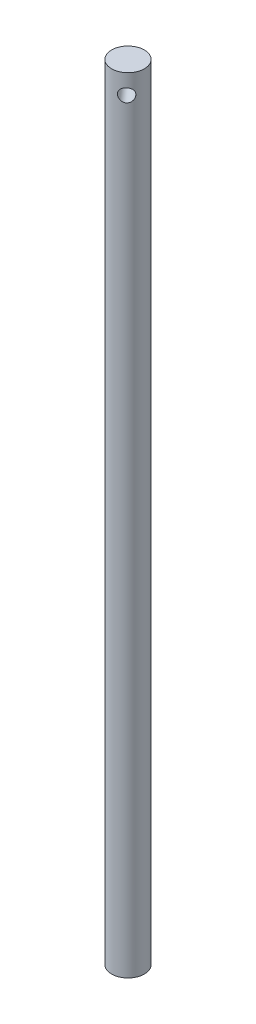
ISO-10303-21;
HEADER;
FILE_DESCRIPTION(('STEP AP214'),'2;1');
FILE_NAME('part.step','',(''),(''),'','','');
FILE_SCHEMA(('AUTOMOTIVE_DESIGN { 1 0 10303 214 1 1 1 1 }'));
ENDSEC;
DATA;
#1=APPLICATION_CONTEXT('core data for automotive mechanical design processes');
#2=APPLICATION_PROTOCOL_DEFINITION('international standard','automotive_design',2000,#1);
#3=PRODUCT_CONTEXT('',#1,'mechanical');
#4=PRODUCT('Part','Part','',(#3));
#5=PRODUCT_RELATED_PRODUCT_CATEGORY('part','',(#4));
#6=PRODUCT_DEFINITION_FORMATION('','',#4);
#7=PRODUCT_DEFINITION_CONTEXT('part definition',#1,'design');
#8=PRODUCT_DEFINITION('design','',#6,#7);
#9=PRODUCT_DEFINITION_SHAPE('','',#8);
#10=(LENGTH_UNIT() NAMED_UNIT(*) SI_UNIT(.MILLI.,.METRE.));
#11=(NAMED_UNIT(*) PLANE_ANGLE_UNIT() SI_UNIT($,.RADIAN.));
#12=(NAMED_UNIT(*) SI_UNIT($,.STERADIAN.) SOLID_ANGLE_UNIT());
#13=UNCERTAINTY_MEASURE_WITH_UNIT(LENGTH_MEASURE(1.E-05),#10,'distance_accuracy_value','');
#14=(GEOMETRIC_REPRESENTATION_CONTEXT(3) GLOBAL_UNCERTAINTY_ASSIGNED_CONTEXT((#13)) GLOBAL_UNIT_ASSIGNED_CONTEXT((#10,
#11,#12)) REPRESENTATION_CONTEXT('',''));
#15=CARTESIAN_POINT('',(0.,0.,0.));
#16=DIRECTION('',(0.,0.,1.));
#17=DIRECTION('',(1.,0.,0.));
#18=AXIS2_PLACEMENT_3D('',#15,#16,#17);
#19=CARTESIAN_POINT('',(0.,600.,0.));
#20=DIRECTION('',(0.,-1.,0.));
#21=DIRECTION('',(0.,0.,-1.));
#22=AXIS2_PLACEMENT_3D('',#19,#20,#21);
#23=CYLINDRICAL_SURFACE('',#22,12.5);
#24=CARTESIAN_POINT('',(0.,1.15470053837929,0.));
#25=DIRECTION('',(0.,1.,0.));
#26=DIRECTION('',(0.,0.,1.));
#27=AXIS2_PLACEMENT_3D('',#24,#25,#26);
#28=CIRCLE('',#27,12.5);
#29=CARTESIAN_POINT('',(0.,1.15470053837929,12.5));
#30=VERTEX_POINT('',#29);
#31=EDGE_CURVE('E38',#30,#30,#28,.T.);
#32=ORIENTED_EDGE('',*,*,#31,.T.);
#33=EDGE_LOOP('',(#32));
#34=FACE_BOUND('',#33,.T.);
#35=CARTESIAN_POINT('',(-3.82591175481368,585.,-11.9001008081601));
#36=CARTESIAN_POINT('',(-3.82591321634147,585.133971655243,-11.9001008985081));
#37=CARTESIAN_POINT('',(-3.8315155385131,585.26798425873,-11.898303691178));
#38=CARTESIAN_POINT('',(-3.85383530270704,585.535040684074,-11.8910927376647));
#39=CARTESIAN_POINT('',(-3.87055954781237,585.668083862565,-11.8856767779451));
#40=CARTESIAN_POINT('',(-3.91488256196639,585.932417886977,-11.8711515279103));
#41=CARTESIAN_POINT('',(-3.94250300121817,586.063704698587,-11.8620348766567));
#42=CARTESIAN_POINT('',(-4.00817171084598,586.323367155234,-11.8400066309087));
#43=CARTESIAN_POINT('',(-4.04622431063963,586.451741567604,-11.8270934606717));
#44=CARTESIAN_POINT('',(-4.13198734052731,586.704153226493,-11.7974034493306));
#45=CARTESIAN_POINT('',(-4.17965637084882,586.828206478644,-11.7806431293739));
#46=CARTESIAN_POINT('',(-4.28407568876819,587.071811981534,-11.743073405729));
#47=CARTESIAN_POINT('',(-4.34082938636788,587.191362521247,-11.7222624809782));
#48=CARTESIAN_POINT('',(-4.5235736294315,587.542072903934,-11.6535068539258));
#49=CARTESIAN_POINT('',(-4.66215655901333,587.765606354612,-11.5992035644342));
#50=CARTESIAN_POINT('',(-4.97444680376112,588.198185788843,-11.4688684376233));
#51=CARTESIAN_POINT('',(-5.14960299031429,588.405879206543,-11.3918557779885));
#52=CARTESIAN_POINT('',(-5.52307254106268,588.788834348201,-11.2155323262324));
#53=CARTESIAN_POINT('',(-5.72139395839523,588.964084738642,-11.116213768573));
#54=CARTESIAN_POINT('',(-6.03448507823224,589.202144785506,-10.9475970824966));
#55=CARTESIAN_POINT('',(-6.14370034042011,589.278566050204,-10.8867513576351));
#56=CARTESIAN_POINT('',(-6.3652607098107,589.420777319505,-10.7587075996834));
#57=CARTESIAN_POINT('',(-6.4776045047684,589.486571705034,-10.6915122024439));
#58=CARTESIAN_POINT('',(-6.70434425538006,589.606954167405,-10.5508093962936));
#59=CARTESIAN_POINT('',(-6.8187404529665,589.661540913551,-10.4773012393302));
#60=CARTESIAN_POINT('',(-7.04839585909712,589.75893966447,-10.3242018437545));
#61=CARTESIAN_POINT('',(-7.16365461834356,589.801757413206,-10.2446135969098));
#62=CARTESIAN_POINT('',(-7.38840566827681,589.873419829983,-10.0836324499451));
#63=CARTESIAN_POINT('',(-7.4979091476307,589.902836638745,-10.0025096258581));
#64=CARTESIAN_POINT('',(-7.71567680544927,589.950284911458,-9.83550444952974));
#65=CARTESIAN_POINT('',(-7.82394150584481,589.968321357787,-9.74962419805145));
#66=CARTESIAN_POINT('',(-8.03831374319186,589.992825891367,-9.57364825821847));
#67=CARTESIAN_POINT('',(-8.1444215241422,589.999295294407,-9.48355305052527));
#68=CARTESIAN_POINT('',(-8.35359937841428,590.000595577903,-9.29982540754158));
#69=CARTESIAN_POINT('',(-8.4566695584011,589.995426867525,-9.20619309672022));
#70=CARTESIAN_POINT('',(-8.65325674628769,589.974130901625,-9.02154627435975));
#71=CARTESIAN_POINT('',(-8.7469846263003,589.958638509005,-8.93068220710033));
#72=CARTESIAN_POINT('',(-8.93046969295714,589.917496067934,-8.74720253045215));
#73=CARTESIAN_POINT('',(-9.02022554897971,589.891842643764,-8.65458634871959));
#74=CARTESIAN_POINT('',(-9.19522185176735,589.830627781662,-8.46842378398272));
#75=CARTESIAN_POINT('',(-9.28046377221643,589.795069601409,-8.37487771655681));
#76=CARTESIAN_POINT('',(-9.4460978617025,589.714366717274,-8.18760668043712));
#77=CARTESIAN_POINT('',(-9.5264881739429,589.669218372569,-8.09388165723421));
#78=CARTESIAN_POINT('',(-9.76219725534076,589.518453755103,-7.81089858743986));
#79=CARTESIAN_POINT('',(-9.90958198332433,589.398390398369,-7.6224853963965));
#80=CARTESIAN_POINT('',(-10.1818114936309,589.123822792255,-7.254876879807));
#81=CARTESIAN_POINT('',(-10.3066485239646,588.969306738542,-7.07568473957891));
#82=CARTESIAN_POINT('',(-10.5412878122311,588.618391843485,-6.72155156518568));
#83=CARTESIAN_POINT('',(-10.6495648508324,588.419909247246,-6.54766205172539));
#84=CARTESIAN_POINT('',(-10.8413073146651,587.992479577374,-6.22505941416677));
#85=CARTESIAN_POINT('',(-10.9247646218431,587.76352257152,-6.07635453430598));
#86=CARTESIAN_POINT('',(-11.0329736797468,587.398027409483,-5.87617832745316));
#87=CARTESIAN_POINT('',(-11.0665603201616,587.270557824321,-5.81254063567368));
#88=CARTESIAN_POINT('',(-11.1275242169763,587.009811220784,-5.69496176758568));
#89=CARTESIAN_POINT('',(-11.1549039944657,586.876536586609,-5.64101665622001));
#90=CARTESIAN_POINT('',(-11.2035517419401,586.605128866879,-5.54377020274472));
#91=CARTESIAN_POINT('',(-11.2248216417862,586.466997330928,-5.50046550039031));
#92=CARTESIAN_POINT('',(-11.2613438559788,586.186875986359,-5.42530043198789));
#93=CARTESIAN_POINT('',(-11.2765966547551,586.044886489325,-5.39343914466224));
#94=CARTESIAN_POINT('',(-11.3003921686034,585.766979437715,-5.34339366820236));
#95=CARTESIAN_POINT('',(-11.309287873888,585.631220838404,-5.32449286226373));
#96=CARTESIAN_POINT('',(-11.3218547371488,585.358382926426,-5.29771896633837));
#97=CARTESIAN_POINT('',(-11.325526204836,585.221303692536,-5.28984522262945));
#98=CARTESIAN_POINT('',(-11.327656541651,584.946954003789,-5.28528179572085));
#99=CARTESIAN_POINT('',(-11.3261167425074,584.809683606744,-5.2885892551872));
#100=CARTESIAN_POINT('',(-11.3178230485988,584.536025817061,-5.3063147434619));
#101=CARTESIAN_POINT('',(-11.3110692852844,584.39963840225,-5.32073249216569));
#102=CARTESIAN_POINT('',(-11.2928617085411,584.136568797751,-5.35926307754278));
#103=CARTESIAN_POINT('',(-11.2816990587561,584.009777948097,-5.38277371922524));
#104=CARTESIAN_POINT('',(-11.2546884133833,583.758756181307,-5.43902094248638));
#105=CARTESIAN_POINT('',(-11.2388389011114,583.634526106789,-5.47176051041582));
#106=CARTESIAN_POINT('',(-11.1841888752905,583.266917748604,-5.58308576150597));
#107=CARTESIAN_POINT('',(-11.1382731087437,583.028417599067,-5.6748088892822));
#108=CARTESIAN_POINT('',(-11.0247217778835,582.560953230666,-5.89245839847456));
#109=CARTESIAN_POINT('',(-10.9562809149479,582.332767956842,-6.01962099083745));
#110=CARTESIAN_POINT('',(-10.7975269847117,581.901309109577,-6.2999505064009));
#111=CARTESIAN_POINT('',(-10.7072050067108,581.698045736063,-6.45312801610351));
#112=CARTESIAN_POINT('',(-10.4962744778948,581.306539182942,-6.79121540783182));
#113=CARTESIAN_POINT('',(-10.3739216068394,581.120514489883,-6.97763346064376));
#114=CARTESIAN_POINT('',(-10.1706053911444,580.870399269982,-7.26793281332155));
#115=CARTESIAN_POINT('',(-10.0994879417559,580.791810216208,-7.36653898800211));
#116=CARTESIAN_POINT('',(-9.95068294342289,580.644825670236,-7.5663323871119));
#117=CARTESIAN_POINT('',(-9.87299824060322,580.576425797379,-7.66751848030861));
#118=CARTESIAN_POINT('',(-9.7111789047654,580.450374006528,-7.87146493378271));
#119=CARTESIAN_POINT('',(-9.62704259786952,580.39272489124,-7.97422569703913));
#120=CARTESIAN_POINT('',(-9.45264307200145,580.288751565808,-8.18020387345566));
#121=CARTESIAN_POINT('',(-9.36238248056111,580.242422537717,-8.28342107324127));
#122=CARTESIAN_POINT('',(-9.17614049948102,580.16154855939,-8.48926999747556));
#123=CARTESIAN_POINT('',(-9.08016042943226,580.12700090324,-8.59190185103306));
#124=CARTESIAN_POINT('',(-8.88303022412005,580.070063061532,-8.79555861750652));
#125=CARTESIAN_POINT('',(-8.78188043889198,580.047672054051,-8.89658363861352));
#126=CARTESIAN_POINT('',(-8.58190193560406,580.016369215074,-9.08949846111823));
#127=CARTESIAN_POINT('',(-8.4833547916009,580.006670902184,-9.18155332947549));
#128=CARTESIAN_POINT('',(-8.2830297997544,579.998220570278,-9.36267347390235));
#129=CARTESIAN_POINT('',(-8.18125087500019,579.999472239034,-9.45173773264622));
#130=CARTESIAN_POINT('',(-7.97533237679134,580.012914686213,-9.62612424486818));
#131=CARTESIAN_POINT('',(-7.8711940551778,580.025099790232,-9.71144841534548));
#132=CARTESIAN_POINT('',(-7.6613132741126,580.060276886538,-9.87786540802629));
#133=CARTESIAN_POINT('',(-7.55557023079432,580.083272908184,-9.95895664003249));
#134=CARTESIAN_POINT('',(-7.34670709100145,580.138959244916,-10.1139641234053));
#135=CARTESIAN_POINT('',(-7.24360795276853,580.171325105981,-10.188025221896));
#136=CARTESIAN_POINT('',(-7.03757771417071,580.245683886629,-10.3314225282711));
#137=CARTESIAN_POINT('',(-6.93464668551002,580.287680182161,-10.400757068177));
#138=CARTESIAN_POINT('',(-6.62739518887194,580.42759290925,-10.6012844431355));
#139=CARTESIAN_POINT('',(-6.42444313335049,580.539479675504,-10.725128374733));
#140=CARTESIAN_POINT('',(-6.02026008625583,580.802772029669,-10.9573409632757));
#141=CARTESIAN_POINT('',(-5.81950147109552,580.955705476892,-11.0647839217924));
#142=CARTESIAN_POINT('',(-5.43611100159755,581.294456552155,-11.2581009253406));
#143=CARTESIAN_POINT('',(-5.25348669888369,581.480287790839,-11.3439660073483));
#144=CARTESIAN_POINT('',(-4.90246161441368,581.89333579431,-11.5002203794308));
#145=CARTESIAN_POINT('',(-4.7356412282728,582.122402397389,-11.5693225644022));
#146=CARTESIAN_POINT('',(-4.51250314930204,582.486119246079,-11.6573467722482));
#147=CARTESIAN_POINT('',(-4.44260240764593,582.610799074631,-11.6840956882274));
#148=CARTESIAN_POINT('',(-4.31277011218214,582.866147041287,-11.7326387562969));
#149=CARTESIAN_POINT('',(-4.25283369678173,582.996812219212,-11.7544353265505));
#150=CARTESIAN_POINT('',(-4.14872158309119,583.251349503869,-11.7915599839054));
#151=CARTESIAN_POINT('',(-4.10361568191428,583.37478383776,-11.8072922637018));
#152=CARTESIAN_POINT('',(-4.02306744183948,583.625129788679,-11.8349796535098));
#153=CARTESIAN_POINT('',(-3.98762072166461,583.752039800342,-11.8469364764109));
#154=CARTESIAN_POINT('',(-3.92697461613383,584.008269786089,-11.8671770562139));
#155=CARTESIAN_POINT('',(-3.90175254868997,584.137583752839,-11.875468947034));
#156=CARTESIAN_POINT('',(-3.8618605771983,584.397953699659,-11.8885019171069));
#157=CARTESIAN_POINT('',(-3.84718454834544,584.529008623516,-11.8932450574274));
#158=CARTESIAN_POINT('',(-3.83390551672384,584.716937696889,-11.8975283586477));
#159=CARTESIAN_POINT('',(-3.83090926706739,584.773499629518,-11.898493129227));
#160=CARTESIAN_POINT('',(-3.82691200395785,584.886705263664,-11.8997793584647));
#161=CARTESIAN_POINT('',(-3.8259111367945,584.943348970872,-11.9001007699557));
#162=CARTESIAN_POINT('',(-3.82591175481368,585.,-11.9001008081601));
#163=B_SPLINE_CURVE_WITH_KNOTS('',3,(#35,#36,#37,#38,#39,#40,#41,#42,#43,#44,#45,#46,#47,#48,
#49,#50,#51,#52,#53,#54,#55,#56,#57,#58,#59,#60,#61,#62,#63,#64,#65,#66,#67,#68,#69,#70,#71,#72,
#73,#74,#75,#76,#77,#78,#79,#80,#81,#82,#83,#84,#85,#86,#87,#88,#89,#90,#91,#92,#93,#94,#95,#96,
#97,#98,#99,#100,#101,#102,#103,#104,#105,#106,#107,#108,#109,#110,#111,#112,#113,#114,#115,
#116,#117,#118,#119,#120,#121,#122,#123,#124,#125,#126,#127,#128,#129,#130,#131,#132,#133,#134,
#135,#136,#137,#138,#139,#140,#141,#142,#143,#144,#145,#146,#147,#148,#149,#150,#151,#152,#153,
#154,#155,#156,#157,#158,#159,#160,#161,#162),.UNSPECIFIED.,.T.,.F.,(4,2,2,2,2,2,2,2,2,2,2,2,2,
2,2,2,2,2,2,2,2,2,2,2,2,2,2,2,2,2,2,2,2,2,2,2,2,2,2,2,2,2,2,2,2,2,2,2,2,2,2,2,2,2,2,2,2,2,2,2,2,
2,2,4),(0.,0.401857604172981,0.803961243888992,1.20686864636052,1.6099435119296,
2.01131877198536,2.41284504624407,3.21490370860736,4.05855844512139,4.90250734671925,
5.34162944437919,5.78057004956794,6.21956274051595,6.65834079517779,7.07605372410075,
7.49358364921535,7.91106607592917,8.32853382527663,8.72244339050932,9.1164839310551,
9.51039502417155,9.90445593031435,10.7036345579603,11.5030874255886,12.3550281541218,
13.2072472302661,13.645908156465,14.0843905878332,14.5227343678117,14.961042850033,
15.3725755678595,15.7840838875774,16.1954870551218,16.6068798510073,16.9947241755282,
17.3826941453684,18.1580219095307,18.9647918095573,19.7718908063862,20.6386062994143,
21.0724736227439,21.5061538706742,21.9399470207648,22.3735552211117,22.8070637643667,
23.2405429940499,23.6456433748876,24.050880192055,24.4559068146868,24.8610845153934,
25.2536349873097,25.6463232787471,26.4310478633779,27.2504496961614,28.0701913317684,
28.9406797498038,29.376493852336,29.8120946932279,30.2087331024768,30.6051913011725,
31.0007651307088,31.3961090374153,31.5660254121741,31.735954243748),.UNSPECIFIED.);
#164=CARTESIAN_POINT('',(-3.82591175481368,585.,-11.9001008081601));
#165=VERTEX_POINT('',#164);
#166=EDGE_CURVE('E49',#165,#165,#163,.T.);
#167=ORIENTED_EDGE('',*,*,#166,.T.);
#168=EDGE_LOOP('',(#167));
#169=FACE_BOUND('',#168,.T.);
#170=CARTESIAN_POINT('',(11.3269180302335,585.,5.28686371456427));
#171=CARTESIAN_POINT('',(11.3269179367374,584.866028344757,5.28686517589429));
#172=CARTESIAN_POINT('',(11.3244329121825,584.73201574127,5.29219815075466));
#173=CARTESIAN_POINT('',(11.3144820817286,584.464959315926,5.31343845907435));
#174=CARTESIAN_POINT('',(11.3070132272998,584.331916137435,5.32935226463899));
#175=CARTESIAN_POINT('',(11.2870486977018,584.067582113022,5.37150591252626));
#176=CARTESIAN_POINT('',(11.2745430042908,583.936295301413,5.39776633192215));
#177=CARTESIAN_POINT('',(11.2444599563877,583.676632844766,5.46015730293379));
#178=CARTESIAN_POINT('',(11.2268804960877,583.548258432396,5.496291952402));
#179=CARTESIAN_POINT('',(11.1866782110148,583.295846773507,5.57765883967114));
#180=CARTESIAN_POINT('',(11.1640769646507,583.171793521356,5.62285207411651));
#181=CARTESIAN_POINT('',(11.1137194015842,582.928188018465,5.72174086990002));
#182=CARTESIAN_POINT('',(11.0859611485275,582.808637478753,5.77543962377259));
#183=CARTESIAN_POINT('',(10.9948492066357,582.457927096066,5.94812838620074));
#184=CARTESIAN_POINT('',(10.923609195114,582.234393645387,6.07881479092384));
#185=CARTESIAN_POINT('',(10.7551707219911,581.801814211157,6.37231253029747));
#186=CARTESIAN_POINT('',(10.6568176219279,581.594120793457,6.53643841838295));
#187=CARTESIAN_POINT('',(10.4350873900812,581.211165651799,6.88487086414641));
#188=CARTESIAN_POINT('',(10.3117015448893,581.035915261358,7.06918443845551));
#189=CARTESIAN_POINT('',(10.1051828713585,580.797855214493,7.35867998872752));
#190=CARTESIAN_POINT('',(10.0311318122399,580.721433949796,7.45941040306252));
#191=CARTESIAN_POINT('',(9.87633527494645,580.579222680495,7.66318045306215));
#192=CARTESIAN_POINT('',(9.79559257627513,580.513428294965,7.76621911710113));
#193=CARTESIAN_POINT('',(9.62758777473844,580.393045832595,7.97354152502331));
#194=CARTESIAN_POINT('',(9.54032489940163,580.338459086449,8.07782541519984));
#195=CARTESIAN_POINT('',(9.35965587300595,580.24106033553,8.28648718312082));
#196=CARTESIAN_POINT('',(9.26625274643347,580.198242586793,8.39086498998277));
#197=CARTESIAN_POINT('',(9.07837861258471,580.126580170017,8.59367345616387));
#198=CARTESIAN_POINT('',(8.98417415081878,580.097163361255,8.69214905700925));
#199=CARTESIAN_POINT('',(8.79119849735773,580.049715088542,8.88727434722943));
#200=CARTESIAN_POINT('',(8.69242932446982,580.031678642213,8.98392481765118));
#201=CARTESIAN_POINT('',(8.49097906179827,580.007174108633,9.1745573941297));
#202=CARTESIAN_POINT('',(8.38829841831437,580.000704705593,9.26853980249006));
#203=CARTESIAN_POINT('',(8.17980841239312,579.999404422097,9.45304763144363));
#204=CARTESIAN_POINT('',(8.07399916007859,580.004573132475,9.54357317345748));
#205=CARTESIAN_POINT('',(7.86617485360345,580.025869098375,9.7154743924383));
#206=CARTESIAN_POINT('',(7.76428263534283,580.041361490995,9.79707813051759));
#207=CARTESIAN_POINT('',(7.5592579966282,580.082503932066,9.95612673613525));
#208=CARTESIAN_POINT('',(7.45612517507065,580.108157356236,10.0335702118233));
#209=CARTESIAN_POINT('',(7.24950245128966,580.169372218338,10.1838607854334));
#210=CARTESIAN_POINT('',(7.14601267750203,580.204930398591,10.2567093849676));
#211=CARTESIAN_POINT('',(6.93946332172123,580.285633282726,10.3975726385001));
#212=CARTESIAN_POINT('',(6.83640391830869,580.330781627431,10.4655854435058));
#213=CARTESIAN_POINT('',(6.52611633821707,580.481546244896,10.6639785040813));
#214=CARTESIAN_POINT('',(6.32072050894784,580.601609601631,10.7865931113707));
#215=CARTESIAN_POINT('',(5.92189836484549,580.876177207745,11.0106150413786));
#216=CARTESIAN_POINT('',(5.72847618156482,581.030693261458,11.1120150723303));
#217=CARTESIAN_POINT('',(5.34773330224028,581.381608156514,11.300431527683));
#218=CARTESIAN_POINT('',(5.16164695239232,581.580090752754,11.3860665110717));
#219=CARTESIAN_POINT('',(4.81756116071224,582.007520422626,11.5358750627646));
#220=CARTESIAN_POINT('',(4.65957091534954,582.23647742848,11.6000416100152));
#221=CARTESIAN_POINT('',(4.44741356461951,582.601972590517,11.6823153757829));
#222=CARTESIAN_POINT('',(4.380068953247,582.729442175679,11.7076633845501));
#223=CARTESIAN_POINT('',(4.25577787205889,582.990188779216,11.7534139481833));
#224=CARTESIAN_POINT('',(4.19882718230233,583.123463413391,11.7738185111992));
#225=CARTESIAN_POINT('',(4.09625150597829,583.394871133121,11.8098976835085));
#226=CARTESIAN_POINT('',(4.05062294383399,583.533002669072,11.8255737864081));
#227=CARTESIAN_POINT('',(3.97147397404644,583.813124013641,11.8523898304684));
#228=CARTESIAN_POINT('',(3.93795259168649,583.955113510675,11.8635301368032));
#229=CARTESIAN_POINT('',(3.88531991753707,584.233020562285,11.8808673166569));
#230=CARTESIAN_POINT('',(3.86545342649941,584.368779161596,11.887324604903));
#231=CARTESIAN_POINT('',(3.83731589290336,584.641617073574,11.8964376043197));
#232=CARTESIAN_POINT('',(3.82904416296761,584.778696307464,11.8990935408478));
#233=CARTESIAN_POINT('',(3.82424976672682,585.053045996211,11.9006352816762));
#234=CARTESIAN_POINT('',(3.82772409873928,585.190316393256,11.8995220491799));
#235=CARTESIAN_POINT('',(3.84634910202157,585.463974182939,11.893514758113));
#236=CARTESIAN_POINT('',(3.86149947892341,585.60036159775,11.8886207948595));
#237=CARTESIAN_POINT('',(3.90200783562321,585.863431202249,11.8753846739078));
#238=CARTESIAN_POINT('',(3.92673188317592,585.990222051903,11.867255928915));
#239=CARTESIAN_POINT('',(3.98592028814203,586.241243818693,11.8475060477608));
#240=CARTESIAN_POINT('',(4.02038779841316,586.365473893212,11.8358837810639));
#241=CARTESIAN_POINT('',(4.13768340944273,586.733082251396,11.7956137365431));
#242=CARTESIAN_POINT('',(4.23443696887326,586.971582400933,11.7615529302673));
#243=CARTESIAN_POINT('',(4.4645993058523,587.439046769334,11.6761684338517));
#244=CARTESIAN_POINT('',(4.59933545679702,587.667232043158,11.624200691507));
#245=CARTESIAN_POINT('',(4.89734776934729,588.098690890423,11.501823776895));
#246=CARTESIAN_POINT('',(5.06063555054674,588.301954263937,11.4314070906645));
#247=CARTESIAN_POINT('',(5.42248835682045,588.693460817058,11.2645019708385));
#248=CARTESIAN_POINT('',(5.62276823291772,588.879485510117,11.1664719412551));
#249=CARTESIAN_POINT('',(5.93625554605879,589.129600730018,11.0011331913225));
#250=CARTESIAN_POINT('',(6.04299572356824,589.208189783792,10.942931784141));
#251=CARTESIAN_POINT('',(6.25986003217856,589.355174329764,10.8203340618633));
#252=CARTESIAN_POINT('',(6.3699826843377,589.423574202621,10.755940428715));
#253=CARTESIAN_POINT('',(6.59259803692794,589.549625993472,10.6209513249815));
#254=CARTESIAN_POINT('',(6.70509134690212,589.60727510876,10.5503542442049));
#255=CARTESIAN_POINT('',(6.9312987314824,589.711248434192,10.4031386779619));
#256=CARTESIAN_POINT('',(7.04501226516092,589.757577462283,10.3265227725826));
#257=CARTESIAN_POINT('',(7.27257529841231,589.83845144061,10.1675418900134));
#258=CARTESIAN_POINT('',(7.38642476072917,589.87299909676,10.0851782381919));
#259=CARTESIAN_POINT('',(7.61317722857827,589.929936938468,9.915120263662));
#260=CARTESIAN_POINT('',(7.72608029758875,589.952327945949,9.82742630178676));
#261=CARTESIAN_POINT('',(7.94253237955099,589.983630784926,9.65319649166946));
#262=CARTESIAN_POINT('',(8.04620987674818,589.993329097816,9.56696068150698));
#263=CARTESIAN_POINT('',(8.25100365419056,590.001779429722,9.39090921801867));
#264=CARTESIAN_POINT('',(8.35211906006691,590.000527760966,9.30109236879661));
#265=CARTESIAN_POINT('',(8.5509331523483,589.987085313787,9.11864774634956));
#266=CARTESIAN_POINT('',(8.64863358378595,589.974900209768,9.02602145530313));
#267=CARTESIAN_POINT('',(8.84003744861054,589.939723113462,8.83864718213933));
#268=CARTESIAN_POINT('',(8.93373937749266,589.916727091816,8.74389842150225));
#269=CARTESIAN_POINT('',(9.11369614285723,589.861040755084,8.55610413600551));
#270=CARTESIAN_POINT('',(9.20009205876654,589.828674894019,8.46309755382874));
#271=CARTESIAN_POINT('',(9.36817518298925,589.754316113371,8.27665906519557));
#272=CARTESIAN_POINT('',(9.44986072748542,589.712319817839,8.18322702087739));
#273=CARTESIAN_POINT('',(9.68730687497231,589.572407090749,7.9035235397805));
#274=CARTESIAN_POINT('',(9.83560502903884,589.460520324496,7.71768889894529));
#275=CARTESIAN_POINT('',(10.1166323758517,589.197227970331,7.3457880355694));
#276=CARTESIAN_POINT('',(10.2483839762512,589.044294523108,7.16007447470736));
#277=CARTESIAN_POINT('',(10.4882169379075,588.705543447845,6.80392862471628));
#278=CARTESIAN_POINT('',(10.5962884605484,588.519712209161,6.63350270461019));
#279=CARTESIAN_POINT('',(10.7952954496521,588.10666420569,6.30482313875623));
#280=CARTESIAN_POINT('',(10.8847559285481,587.877597602611,6.14797615626789));
#281=CARTESIAN_POINT('',(11.0000460134776,587.513880753921,5.93762630537507));
#282=CARTESIAN_POINT('',(11.0353428080652,587.389200925369,5.87162816538633));
#283=CARTESIAN_POINT('',(11.0997715253289,587.133852958713,5.74890166134275));
#284=CARTESIAN_POINT('',(11.1289064562766,587.003187780788,5.69216877701151));
#285=CARTESIAN_POINT('',(11.178783967498,586.748650496131,5.59352899662246));
#286=CARTESIAN_POINT('',(11.2000441110778,586.62521616224,5.55074987503801));
#287=CARTESIAN_POINT('',(11.2376061348746,586.374870211321,5.47430574575511));
#288=CARTESIAN_POINT('',(11.2539102634635,586.247960199658,5.44063660593832));
#289=CARTESIAN_POINT('',(11.281590392776,585.991730213912,5.38300465622242));
#290=CARTESIAN_POINT('',(11.2929773054206,585.862416247161,5.35902036219607));
#291=CARTESIAN_POINT('',(11.3109060981469,585.602046300341,5.32107584889332));
#292=CARTESIAN_POINT('',(11.3174507905022,585.470991376484,5.30710981133927));
#293=CARTESIAN_POINT('',(11.3233642214945,585.283062303111,5.29447214209002));
#294=CARTESIAN_POINT('',(11.3246968241712,585.226500370482,5.29162039448877));
#295=CARTESIAN_POINT('',(11.3264737808714,585.113294736336,5.28781580214479));
#296=CARTESIAN_POINT('',(11.3269180697691,585.056651029128,5.28686309662872));
#297=CARTESIAN_POINT('',(11.3269180302335,585.,5.28686371456427));
#298=B_SPLINE_CURVE_WITH_KNOTS('',3,(#170,#171,#172,#173,#174,#175,#176,#177,#178,#179,#180,
#181,#182,#183,#184,#185,#186,#187,#188,#189,#190,#191,#192,#193,#194,#195,#196,#197,#198,#199,
#200,#201,#202,#203,#204,#205,#206,#207,#208,#209,#210,#211,#212,#213,#214,#215,#216,#217,#218,
#219,#220,#221,#222,#223,#224,#225,#226,#227,#228,#229,#230,#231,#232,#233,#234,#235,#236,#237,
#238,#239,#240,#241,#242,#243,#244,#245,#246,#247,#248,#249,#250,#251,#252,#253,#254,#255,#256,
#257,#258,#259,#260,#261,#262,#263,#264,#265,#266,#267,#268,#269,#270,#271,#272,#273,#274,#275,
#276,#277,#278,#279,#280,#281,#282,#283,#284,#285,#286,#287,#288,#289,#290,#291,#292,#293,#294,
#295,#296,#297),.UNSPECIFIED.,.T.,.F.,(4,2,2,2,2,2,2,2,2,2,2,2,2,2,2,2,2,2,2,2,2,2,2,2,2,2,2,2,
2,2,2,2,2,2,2,2,2,2,2,2,2,2,2,2,2,2,2,2,2,2,2,2,2,2,2,2,2,2,2,2,2,2,2,4),(0.,0.401857604173087,
0.803961243889093,1.20686864636061,1.6099435119296,2.01131877198558,2.41284504624433,
3.21490370860731,4.05855844512154,4.90250734671943,5.34162944437932,5.78057004956813,
6.21956274051611,6.65834079517797,7.0760537241009,7.49358364921546,7.91106607592926,
8.32853382527668,8.72244339050935,9.11648393105514,9.51039502417158,9.90445593031438,
10.7036345579603,11.5030874255886,12.3550281541217,13.2072472302661,13.6459081564649,
14.0843905878331,14.5227343678117,14.961042850033,15.3725755678595,15.7840838875773,
16.1954870551218,16.6068798510073,16.9947241755284,17.3826941453686,18.1580219095308,
18.9647918095575,19.7718908063863,20.6386062994145,21.072473622744,21.5061538706743,
21.9399470207649,22.3735552211118,22.8070637643668,23.24054299405,23.6456433748878,
24.0508801920551,24.4559068146869,24.8610845153935,25.2536349873097,25.6463232787471,
26.4310478633779,27.2504496961613,28.0701913317683,28.9406797498035,29.3764938523357,
29.8120946932277,30.2087331024766,30.6051913011725,31.0007651307086,31.3961090374152,
31.5660254121741,31.735954243748),.UNSPECIFIED.);
#299=CARTESIAN_POINT('',(11.3269180302335,585.,5.28686371456427));
#300=VERTEX_POINT('',#299);
#301=EDGE_CURVE('E42',#300,#300,#298,.T.);
#302=ORIENTED_EDGE('',*,*,#301,.T.);
#303=EDGE_LOOP('',(#302));
#304=FACE_BOUND('',#303,.T.);
#305=CARTESIAN_POINT('',(0.,600.,0.));
#306=DIRECTION('',(0.,1.,0.));
#307=DIRECTION('',(0.,0.,1.));
#308=AXIS2_PLACEMENT_3D('',#305,#306,#307);
#309=CIRCLE('',#308,12.5);
#310=CARTESIAN_POINT('',(0.,600.,12.5));
#311=VERTEX_POINT('',#310);
#312=EDGE_CURVE('E46',#311,#311,#309,.T.);
#313=ORIENTED_EDGE('',*,*,#312,.F.);
#314=EDGE_LOOP('',(#313));
#315=FACE_BOUND('',#314,.T.);
#316=ADVANCED_FACE('F31',(#34,#169,#304,#315),#23,.T.);
#317=CARTESIAN_POINT('',(0.,600.,0.));
#318=DIRECTION('',(0.,1.,0.));
#319=DIRECTION('',(0.,0.,1.));
#320=AXIS2_PLACEMENT_3D('',#317,#318,#319);
#321=PLANE('',#320);
#322=ORIENTED_EDGE('',*,*,#312,.T.);
#323=EDGE_LOOP('',(#322));
#324=FACE_BOUND('',#323,.T.);
#325=ADVANCED_FACE('F65',(#324),#321,.T.);
#326=CARTESIAN_POINT('',(0.,0.,0.));
#327=DIRECTION('',(0.,1.,0.));
#328=DIRECTION('',(0.,0.,1.));
#329=AXIS2_PLACEMENT_3D('',#326,#327,#328);
#330=PLANE('',#329);
#331=CARTESIAN_POINT('',(0.,0.,0.));
#332=DIRECTION('',(0.,1.,0.));
#333=DIRECTION('',(0.,0.,1.));
#334=AXIS2_PLACEMENT_3D('',#331,#332,#333);
#335=CIRCLE('',#334,10.5);
#336=CARTESIAN_POINT('',(0.,0.,10.5));
#337=VERTEX_POINT('',#336);
#338=EDGE_CURVE('E10',#337,#337,#335,.F.);
#339=ORIENTED_EDGE('',*,*,#338,.T.);
#340=EDGE_LOOP('',(#339));
#341=FACE_BOUND('',#340,.T.);
#342=ADVANCED_FACE('F63',(#341),#330,.F.);
#343=CARTESIAN_POINT('',(-444.740194544345,585.,-504.442672021963));
#344=DIRECTION('',(0.661323709359621,0.,0.750100627541953));
#345=DIRECTION('',(0.750100627541953,0.,-0.661323709359621));
#346=AXIS2_PLACEMENT_3D('',#343,#344,#345);
#347=CYLINDRICAL_SURFACE('',#346,5.);
#348=ORIENTED_EDGE('',*,*,#301,.F.);
#349=EDGE_LOOP('',(#348));
#350=FACE_BOUND('',#349,.T.);
#351=ORIENTED_EDGE('',*,*,#166,.F.);
#352=EDGE_LOOP('',(#351));
#353=FACE_BOUND('',#352,.T.);
#354=ADVANCED_FACE('F59',(#350,#353),#347,.F.);
#355=CARTESIAN_POINT('',(0.,1.15470053837929,0.));
#356=DIRECTION('',(0.,1.,0.));
#357=DIRECTION('',(0.,0.,1.));
#358=AXIS2_PLACEMENT_3D('',#355,#356,#357);
#359=CONICAL_SURFACE('',#358,12.5,1.04719755119659);
#360=ORIENTED_EDGE('',*,*,#338,.F.);
#361=EDGE_LOOP('',(#360));
#362=FACE_BOUND('',#361,.T.);
#363=ORIENTED_EDGE('',*,*,#31,.F.);
#364=EDGE_LOOP('',(#363));
#365=FACE_BOUND('',#364,.T.);
#366=ADVANCED_FACE('F33',(#362,#365),#359,.T.);
#367=CLOSED_SHELL('',(#316,#325,#342,#354,#366));
#368=MANIFOLD_SOLID_BREP('B2',#367);
#369=ADVANCED_BREP_SHAPE_REPRESENTATION('',(#18,#368),#14);
#370=SHAPE_DEFINITION_REPRESENTATION(#9,#369);
ENDSEC;
END-ISO-10303-21;
